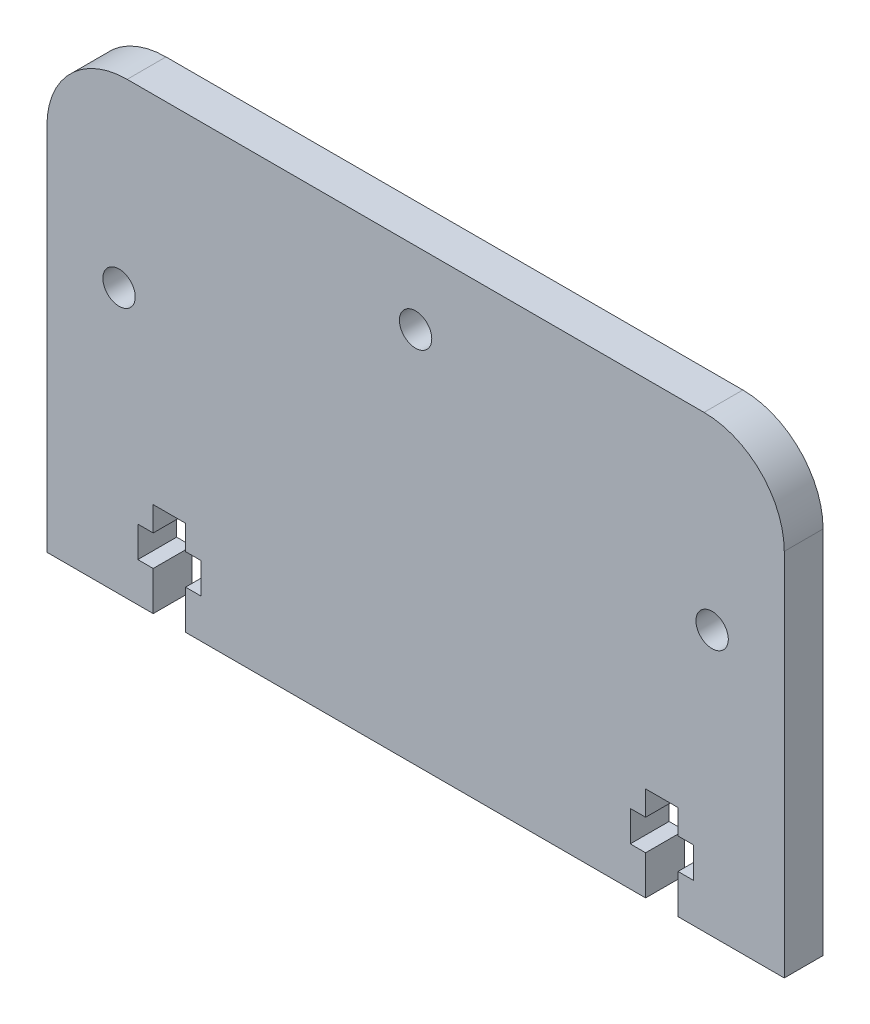
ISO-10303-21;
HEADER;
FILE_DESCRIPTION(('STEP AP214'),'2;1');
FILE_NAME('part.step','',(''),(''),'','','');
FILE_SCHEMA(('AUTOMOTIVE_DESIGN { 1 0 10303 214 1 1 1 1 }'));
ENDSEC;
DATA;
#1=APPLICATION_CONTEXT('core data for automotive mechanical design processes');
#2=APPLICATION_PROTOCOL_DEFINITION('international standard','automotive_design',2000,#1);
#3=PRODUCT_CONTEXT('',#1,'mechanical');
#4=PRODUCT('Part','Part','',(#3));
#5=PRODUCT_RELATED_PRODUCT_CATEGORY('part','',(#4));
#6=PRODUCT_DEFINITION_FORMATION('','',#4);
#7=PRODUCT_DEFINITION_CONTEXT('part definition',#1,'design');
#8=PRODUCT_DEFINITION('design','',#6,#7);
#9=PRODUCT_DEFINITION_SHAPE('','',#8);
#10=(LENGTH_UNIT() NAMED_UNIT(*) SI_UNIT(.MILLI.,.METRE.));
#11=(NAMED_UNIT(*) PLANE_ANGLE_UNIT() SI_UNIT($,.RADIAN.));
#12=(NAMED_UNIT(*) SI_UNIT($,.STERADIAN.) SOLID_ANGLE_UNIT());
#13=UNCERTAINTY_MEASURE_WITH_UNIT(LENGTH_MEASURE(1.E-05),#10,'distance_accuracy_value','');
#14=(GEOMETRIC_REPRESENTATION_CONTEXT(3) GLOBAL_UNCERTAINTY_ASSIGNED_CONTEXT((#13)) GLOBAL_UNIT_ASSIGNED_CONTEXT((#10,
#11,#12)) REPRESENTATION_CONTEXT('',''));
#15=CARTESIAN_POINT('',(0.,0.,0.));
#16=DIRECTION('',(0.,0.,1.));
#17=DIRECTION('',(1.,0.,0.));
#18=AXIS2_PLACEMENT_3D('',#15,#16,#17);
#19=CARTESIAN_POINT('',(-56.975,0.,6.));
#20=DIRECTION('',(0.,1.,0.));
#21=DIRECTION('',(-1.,0.,0.));
#22=AXIS2_PLACEMENT_3D('',#19,#20,#21);
#23=PLANE('',#22);
#24=DIRECTION('',(0.,0.,1.));
#25=VECTOR('',#24,1.);
#26=CARTESIAN_POINT('',(35.55,0.,0.));
#27=LINE('',#26,#25);
#28=CARTESIAN_POINT('',(35.55,0.,0.));
#29=VERTEX_POINT('',#28);
#30=CARTESIAN_POINT('',(35.55,0.,6.));
#31=VERTEX_POINT('',#30);
#32=EDGE_CURVE('E229',#29,#31,#27,.T.);
#33=ORIENTED_EDGE('',*,*,#32,.T.);
#34=DIRECTION('',(1.,0.,0.));
#35=VECTOR('',#34,1.);
#36=CARTESIAN_POINT('',(-56.975,0.,6.));
#37=LINE('',#36,#35);
#38=CARTESIAN_POINT('',(-35.55,0.,6.));
#39=VERTEX_POINT('',#38);
#40=EDGE_CURVE('E372',#39,#31,#37,.T.);
#41=ORIENTED_EDGE('',*,*,#40,.F.);
#42=DIRECTION('',(0.,0.,1.));
#43=VECTOR('',#42,1.);
#44=CARTESIAN_POINT('',(-35.55,0.,0.));
#45=LINE('',#44,#43);
#46=CARTESIAN_POINT('',(-35.55,0.,0.));
#47=VERTEX_POINT('',#46);
#48=EDGE_CURVE('E255',#47,#39,#45,.T.);
#49=ORIENTED_EDGE('',*,*,#48,.F.);
#50=DIRECTION('',(1.,0.,0.));
#51=VECTOR('',#50,1.);
#52=CARTESIAN_POINT('',(-56.975,0.,0.));
#53=LINE('',#52,#51);
#54=EDGE_CURVE('E249',#47,#29,#53,.T.);
#55=ORIENTED_EDGE('',*,*,#54,.T.);
#56=EDGE_LOOP('',(#33,#41,#49,#55));
#57=FACE_BOUND('',#56,.T.);
#58=ADVANCED_FACE('F33',(#57),#23,.F.);
#59=DIRECTION('',(0.,0.,1.));
#60=VECTOR('',#59,1.);
#61=CARTESIAN_POINT('',(40.55,0.,0.));
#62=LINE('',#61,#60);
#63=CARTESIAN_POINT('',(40.55,0.,0.));
#64=VERTEX_POINT('',#63);
#65=CARTESIAN_POINT('',(40.55,0.,6.));
#66=VERTEX_POINT('',#65);
#67=EDGE_CURVE('E241',#64,#66,#62,.T.);
#68=ORIENTED_EDGE('',*,*,#67,.F.);
#69=CARTESIAN_POINT('',(56.975,0.,0.));
#70=VERTEX_POINT('',#69);
#71=EDGE_CURVE('E257',#64,#70,#53,.T.);
#72=ORIENTED_EDGE('',*,*,#71,.T.);
#73=DIRECTION('',(0.,0.,-1.));
#74=VECTOR('',#73,1.);
#75=CARTESIAN_POINT('',(56.975,0.,6.));
#76=LINE('',#75,#74);
#77=CARTESIAN_POINT('',(56.975,0.,6.));
#78=VERTEX_POINT('',#77);
#79=EDGE_CURVE('E281',#78,#70,#76,.T.);
#80=ORIENTED_EDGE('',*,*,#79,.F.);
#81=EDGE_CURVE('E369',#66,#78,#37,.T.);
#82=ORIENTED_EDGE('',*,*,#81,.F.);
#83=EDGE_LOOP('',(#68,#72,#80,#82));
#84=FACE_BOUND('',#83,.T.);
#85=ADVANCED_FACE('F403',(#84),#23,.F.);
#86=CARTESIAN_POINT('',(-44.575,57.1,6.));
#87=DIRECTION('',(0.,0.,-1.));
#88=DIRECTION('',(-1.,0.,0.));
#89=AXIS2_PLACEMENT_3D('',#86,#87,#88);
#90=PLANE('',#89);
#91=CARTESIAN_POINT('',(45.825,41.,6.));
#92=DIRECTION('',(0.,0.,-1.));
#93=DIRECTION('',(-1.,0.,0.));
#94=AXIS2_PLACEMENT_3D('',#91,#92,#93);
#95=CIRCLE('',#94,2.5);
#96=CARTESIAN_POINT('',(43.325,41.,6.));
#97=VERTEX_POINT('',#96);
#98=EDGE_CURVE('E843',#97,#97,#95,.T.);
#99=ORIENTED_EDGE('',*,*,#98,.T.);
#100=EDGE_LOOP('',(#99));
#101=FACE_BOUND('',#100,.T.);
#102=CARTESIAN_POINT('',(-45.825,41.,6.));
#103=DIRECTION('',(0.,0.,1.));
#104=DIRECTION('',(1.,0.,0.));
#105=AXIS2_PLACEMENT_3D('',#102,#103,#104);
#106=CIRCLE('',#105,2.5);
#107=CARTESIAN_POINT('',(-43.325,41.,6.));
#108=VERTEX_POINT('',#107);
#109=EDGE_CURVE('E482',#108,#108,#106,.T.);
#110=ORIENTED_EDGE('',*,*,#109,.F.);
#111=EDGE_LOOP('',(#110));
#112=FACE_BOUND('',#111,.T.);
#113=CARTESIAN_POINT('',(0.,58.3,6.));
#114=DIRECTION('',(0.,0.,1.));
#115=DIRECTION('',(1.,0.,0.));
#116=AXIS2_PLACEMENT_3D('',#113,#114,#115);
#117=CIRCLE('',#116,2.5);
#118=CARTESIAN_POINT('',(2.5,58.3,6.));
#119=VERTEX_POINT('',#118);
#120=EDGE_CURVE('E460',#119,#119,#117,.T.);
#121=ORIENTED_EDGE('',*,*,#120,.F.);
#122=EDGE_LOOP('',(#121));
#123=FACE_BOUND('',#122,.T.);
#124=DIRECTION('',(0.,1.,0.));
#125=VECTOR('',#124,1.);
#126=CARTESIAN_POINT('',(35.55,0.,6.));
#127=LINE('',#126,#125);
#128=CARTESIAN_POINT('',(35.55,6.05,6.));
#129=VERTEX_POINT('',#128);
#130=EDGE_CURVE('E236',#31,#129,#127,.T.);
#131=ORIENTED_EDGE('',*,*,#130,.T.);
#132=DIRECTION('',(-1.,0.,0.));
#133=VECTOR('',#132,1.);
#134=CARTESIAN_POINT('',(35.55,6.05,6.));
#135=LINE('',#134,#133);
#136=CARTESIAN_POINT('',(33.175,6.05000000000001,6.));
#137=VERTEX_POINT('',#136);
#138=EDGE_CURVE('E252',#129,#137,#135,.T.);
#139=ORIENTED_EDGE('',*,*,#138,.T.);
#140=DIRECTION('',(0.,1.,0.));
#141=VECTOR('',#140,1.);
#142=CARTESIAN_POINT('',(33.175,6.05000000000001,6.));
#143=LINE('',#142,#141);
#144=CARTESIAN_POINT('',(33.175,10.8,6.));
#145=VERTEX_POINT('',#144);
#146=EDGE_CURVE('E453',#137,#145,#143,.T.);
#147=ORIENTED_EDGE('',*,*,#146,.T.);
#148=DIRECTION('',(1.,0.,0.));
#149=VECTOR('',#148,1.);
#150=CARTESIAN_POINT('',(33.175,10.8,6.));
#151=LINE('',#150,#149);
#152=CARTESIAN_POINT('',(35.55,10.8,6.));
#153=VERTEX_POINT('',#152);
#154=EDGE_CURVE('E450',#145,#153,#151,.T.);
#155=ORIENTED_EDGE('',*,*,#154,.T.);
#156=DIRECTION('',(0.,1.,0.));
#157=VECTOR('',#156,1.);
#158=CARTESIAN_POINT('',(35.55,10.8,6.));
#159=LINE('',#158,#157);
#160=CARTESIAN_POINT('',(35.55,14.6,6.));
#161=VERTEX_POINT('',#160);
#162=EDGE_CURVE('E447',#153,#161,#159,.T.);
#163=ORIENTED_EDGE('',*,*,#162,.T.);
#164=DIRECTION('',(1.,0.,0.));
#165=VECTOR('',#164,1.);
#166=CARTESIAN_POINT('',(35.55,14.6,6.));
#167=LINE('',#166,#165);
#168=CARTESIAN_POINT('',(40.55,14.6,6.));
#169=VERTEX_POINT('',#168);
#170=EDGE_CURVE('E444',#161,#169,#167,.T.);
#171=ORIENTED_EDGE('',*,*,#170,.T.);
#172=DIRECTION('',(0.,-1.,0.));
#173=VECTOR('',#172,1.);
#174=CARTESIAN_POINT('',(40.55,14.6,6.));
#175=LINE('',#174,#173);
#176=CARTESIAN_POINT('',(40.55,10.8,6.));
#177=VERTEX_POINT('',#176);
#178=EDGE_CURVE('E441',#169,#177,#175,.T.);
#179=ORIENTED_EDGE('',*,*,#178,.T.);
#180=DIRECTION('',(1.,0.,0.));
#181=VECTOR('',#180,1.);
#182=CARTESIAN_POINT('',(40.55,10.8,6.));
#183=LINE('',#182,#181);
#184=CARTESIAN_POINT('',(42.925,10.8,6.));
#185=VERTEX_POINT('',#184);
#186=EDGE_CURVE('E438',#177,#185,#183,.T.);
#187=ORIENTED_EDGE('',*,*,#186,.T.);
#188=DIRECTION('',(0.,-1.,0.));
#189=VECTOR('',#188,1.);
#190=CARTESIAN_POINT('',(42.925,10.8,6.));
#191=LINE('',#190,#189);
#192=CARTESIAN_POINT('',(42.925,6.05,6.));
#193=VERTEX_POINT('',#192);
#194=EDGE_CURVE('E435',#185,#193,#191,.T.);
#195=ORIENTED_EDGE('',*,*,#194,.T.);
#196=DIRECTION('',(-1.,0.,0.));
#197=VECTOR('',#196,1.);
#198=CARTESIAN_POINT('',(42.925,6.05,6.));
#199=LINE('',#198,#197);
#200=CARTESIAN_POINT('',(40.55,6.05,6.));
#201=VERTEX_POINT('',#200);
#202=EDGE_CURVE('E432',#193,#201,#199,.T.);
#203=ORIENTED_EDGE('',*,*,#202,.T.);
#204=DIRECTION('',(0.,-1.,0.));
#205=VECTOR('',#204,1.);
#206=CARTESIAN_POINT('',(40.55,6.05,6.));
#207=LINE('',#206,#205);
#208=EDGE_CURVE('E428',#201,#66,#207,.T.);
#209=ORIENTED_EDGE('',*,*,#208,.T.);
#210=ORIENTED_EDGE('',*,*,#81,.T.);
#211=DIRECTION('',(0.,1.,0.));
#212=VECTOR('',#211,1.);
#213=CARTESIAN_POINT('',(56.975,0.,6.));
#214=LINE('',#213,#212);
#215=CARTESIAN_POINT('',(56.975,57.1,6.));
#216=VERTEX_POINT('',#215);
#217=EDGE_CURVE('E371',#78,#216,#214,.T.);
#218=ORIENTED_EDGE('',*,*,#217,.T.);
#219=CARTESIAN_POINT('',(44.575,57.1,6.));
#220=DIRECTION('',(0.,0.,1.));
#221=DIRECTION('',(-1.,0.,0.));
#222=AXIS2_PLACEMENT_3D('',#219,#220,#221);
#223=CIRCLE('',#222,12.4);
#224=CARTESIAN_POINT('',(44.575,69.5,6.));
#225=VERTEX_POINT('',#224);
#226=EDGE_CURVE('E374',#216,#225,#223,.T.);
#227=ORIENTED_EDGE('',*,*,#226,.T.);
#228=DIRECTION('',(-1.,0.,0.));
#229=VECTOR('',#228,1.);
#230=CARTESIAN_POINT('',(-44.575,69.5,6.));
#231=LINE('',#230,#229);
#232=CARTESIAN_POINT('',(-44.575,69.5,6.));
#233=VERTEX_POINT('',#232);
#234=EDGE_CURVE('E275',#225,#233,#231,.T.);
#235=ORIENTED_EDGE('',*,*,#234,.T.);
#236=CARTESIAN_POINT('',(-44.575,57.1,6.));
#237=DIRECTION('',(0.,0.,1.));
#238=DIRECTION('',(-1.,0.,0.));
#239=AXIS2_PLACEMENT_3D('',#236,#237,#238);
#240=CIRCLE('',#239,12.4);
#241=CARTESIAN_POINT('',(-56.975,57.1,6.));
#242=VERTEX_POINT('',#241);
#243=EDGE_CURVE('E270',#233,#242,#240,.T.);
#244=ORIENTED_EDGE('',*,*,#243,.T.);
#245=DIRECTION('',(0.,-1.,0.));
#246=VECTOR('',#245,1.);
#247=CARTESIAN_POINT('',(-56.975,0.,6.));
#248=LINE('',#247,#246);
#249=CARTESIAN_POINT('',(-56.975,0.,6.));
#250=VERTEX_POINT('',#249);
#251=EDGE_CURVE('E367',#242,#250,#248,.T.);
#252=ORIENTED_EDGE('',*,*,#251,.T.);
#253=CARTESIAN_POINT('',(-40.55,0.,6.));
#254=VERTEX_POINT('',#253);
#255=EDGE_CURVE('E291',#250,#254,#37,.T.);
#256=ORIENTED_EDGE('',*,*,#255,.T.);
#257=DIRECTION('',(0.,-1.,0.));
#258=VECTOR('',#257,1.);
#259=CARTESIAN_POINT('',(-40.55,6.05,6.));
#260=LINE('',#259,#258);
#261=CARTESIAN_POINT('',(-40.55,6.05,6.));
#262=VERTEX_POINT('',#261);
#263=EDGE_CURVE('E341',#262,#254,#260,.T.);
#264=ORIENTED_EDGE('',*,*,#263,.F.);
#265=DIRECTION('',(1.,0.,0.));
#266=VECTOR('',#265,1.);
#267=CARTESIAN_POINT('',(-42.925,6.05,6.));
#268=LINE('',#267,#266);
#269=CARTESIAN_POINT('',(-42.925,6.05,6.));
#270=VERTEX_POINT('',#269);
#271=EDGE_CURVE('E338',#270,#262,#268,.T.);
#272=ORIENTED_EDGE('',*,*,#271,.F.);
#273=DIRECTION('',(0.,-1.,0.));
#274=VECTOR('',#273,1.);
#275=CARTESIAN_POINT('',(-42.925,10.8,6.));
#276=LINE('',#275,#274);
#277=CARTESIAN_POINT('',(-42.925,10.8,6.));
#278=VERTEX_POINT('',#277);
#279=EDGE_CURVE('E335',#278,#270,#276,.T.);
#280=ORIENTED_EDGE('',*,*,#279,.F.);
#281=DIRECTION('',(-1.,0.,0.));
#282=VECTOR('',#281,1.);
#283=CARTESIAN_POINT('',(-40.55,10.8,6.));
#284=LINE('',#283,#282);
#285=CARTESIAN_POINT('',(-40.55,10.8,6.));
#286=VERTEX_POINT('',#285);
#287=EDGE_CURVE('E332',#286,#278,#284,.T.);
#288=ORIENTED_EDGE('',*,*,#287,.F.);
#289=DIRECTION('',(0.,-1.,0.));
#290=VECTOR('',#289,1.);
#291=CARTESIAN_POINT('',(-40.55,14.6,6.));
#292=LINE('',#291,#290);
#293=CARTESIAN_POINT('',(-40.55,14.6,6.));
#294=VERTEX_POINT('',#293);
#295=EDGE_CURVE('E329',#294,#286,#292,.T.);
#296=ORIENTED_EDGE('',*,*,#295,.F.);
#297=DIRECTION('',(-1.,0.,0.));
#298=VECTOR('',#297,1.);
#299=CARTESIAN_POINT('',(-35.55,14.6,6.));
#300=LINE('',#299,#298);
#301=CARTESIAN_POINT('',(-35.55,14.6,6.));
#302=VERTEX_POINT('',#301);
#303=EDGE_CURVE('E326',#302,#294,#300,.T.);
#304=ORIENTED_EDGE('',*,*,#303,.F.);
#305=DIRECTION('',(0.,1.,0.));
#306=VECTOR('',#305,1.);
#307=CARTESIAN_POINT('',(-35.55,10.8,6.));
#308=LINE('',#307,#306);
#309=CARTESIAN_POINT('',(-35.55,10.8,6.));
#310=VERTEX_POINT('',#309);
#311=EDGE_CURVE('E323',#310,#302,#308,.T.);
#312=ORIENTED_EDGE('',*,*,#311,.F.);
#313=DIRECTION('',(-1.,0.,0.));
#314=VECTOR('',#313,1.);
#315=CARTESIAN_POINT('',(-33.175,10.8,6.));
#316=LINE('',#315,#314);
#317=CARTESIAN_POINT('',(-33.175,10.8,6.));
#318=VERTEX_POINT('',#317);
#319=EDGE_CURVE('E320',#318,#310,#316,.T.);
#320=ORIENTED_EDGE('',*,*,#319,.F.);
#321=DIRECTION('',(0.,1.,0.));
#322=VECTOR('',#321,1.);
#323=CARTESIAN_POINT('',(-33.175,6.05000000000001,6.));
#324=LINE('',#323,#322);
#325=CARTESIAN_POINT('',(-33.175,6.05000000000001,6.));
#326=VERTEX_POINT('',#325);
#327=EDGE_CURVE('E317',#326,#318,#324,.T.);
#328=ORIENTED_EDGE('',*,*,#327,.F.);
#329=DIRECTION('',(1.,0.,0.));
#330=VECTOR('',#329,1.);
#331=CARTESIAN_POINT('',(-35.55,6.05,6.));
#332=LINE('',#331,#330);
#333=CARTESIAN_POINT('',(-35.55,6.05,6.));
#334=VERTEX_POINT('',#333);
#335=EDGE_CURVE('E313',#334,#326,#332,.T.);
#336=ORIENTED_EDGE('',*,*,#335,.F.);
#337=DIRECTION('',(0.,1.,0.));
#338=VECTOR('',#337,1.);
#339=CARTESIAN_POINT('',(-35.55,0.,6.));
#340=LINE('',#339,#338);
#341=EDGE_CURVE('E310',#39,#334,#340,.T.);
#342=ORIENTED_EDGE('',*,*,#341,.F.);
#343=ORIENTED_EDGE('',*,*,#40,.T.);
#344=EDGE_LOOP('',(#131,#139,#147,#155,#163,#171,#179,#187,#195,#203,#209,#210,#218,#227,#235,
#244,#252,#256,#264,#272,#280,#288,#296,#304,#312,#320,#328,#336,#342,#343));
#345=FACE_BOUND('',#344,.T.);
#346=ADVANCED_FACE('F383',(#101,#112,#123,#345),#90,.F.);
#347=CARTESIAN_POINT('',(-44.575,57.1,0.));
#348=DIRECTION('',(0.,0.,-1.));
#349=DIRECTION('',(-1.,0.,0.));
#350=AXIS2_PLACEMENT_3D('',#347,#348,#349);
#351=PLANE('',#350);
#352=CARTESIAN_POINT('',(45.825,41.,0.));
#353=DIRECTION('',(0.,0.,-1.));
#354=DIRECTION('',(-1.,0.,0.));
#355=AXIS2_PLACEMENT_3D('',#352,#353,#354);
#356=CIRCLE('',#355,2.5);
#357=CARTESIAN_POINT('',(43.325,41.,0.));
#358=VERTEX_POINT('',#357);
#359=EDGE_CURVE('E429',#358,#358,#356,.T.);
#360=ORIENTED_EDGE('',*,*,#359,.F.);
#361=EDGE_LOOP('',(#360));
#362=FACE_BOUND('',#361,.T.);
#363=CARTESIAN_POINT('',(0.,58.3,0.));
#364=DIRECTION('',(0.,0.,1.));
#365=DIRECTION('',(1.,0.,0.));
#366=AXIS2_PLACEMENT_3D('',#363,#364,#365);
#367=CIRCLE('',#366,2.5);
#368=CARTESIAN_POINT('',(2.5,58.3,0.));
#369=VERTEX_POINT('',#368);
#370=EDGE_CURVE('E479',#369,#369,#367,.T.);
#371=ORIENTED_EDGE('',*,*,#370,.T.);
#372=EDGE_LOOP('',(#371));
#373=FACE_BOUND('',#372,.T.);
#374=CARTESIAN_POINT('',(-45.825,41.,0.));
#375=DIRECTION('',(0.,0.,1.));
#376=DIRECTION('',(1.,0.,0.));
#377=AXIS2_PLACEMENT_3D('',#374,#375,#376);
#378=CIRCLE('',#377,2.5);
#379=CARTESIAN_POINT('',(-43.325,41.,0.));
#380=VERTEX_POINT('',#379);
#381=EDGE_CURVE('E314',#380,#380,#378,.T.);
#382=ORIENTED_EDGE('',*,*,#381,.T.);
#383=EDGE_LOOP('',(#382));
#384=FACE_BOUND('',#383,.T.);
#385=DIRECTION('',(-1.,0.,0.));
#386=VECTOR('',#385,1.);
#387=CARTESIAN_POINT('',(35.55,6.05,0.));
#388=LINE('',#387,#386);
#389=CARTESIAN_POINT('',(35.55,6.05,0.));
#390=VERTEX_POINT('',#389);
#391=CARTESIAN_POINT('',(33.175,6.05000000000001,0.));
#392=VERTEX_POINT('',#391);
#393=EDGE_CURVE('E242',#390,#392,#388,.T.);
#394=ORIENTED_EDGE('',*,*,#393,.F.);
#395=DIRECTION('',(0.,1.,0.));
#396=VECTOR('',#395,1.);
#397=CARTESIAN_POINT('',(35.55,0.,0.));
#398=LINE('',#397,#396);
#399=EDGE_CURVE('E233',#29,#390,#398,.T.);
#400=ORIENTED_EDGE('',*,*,#399,.F.);
#401=ORIENTED_EDGE('',*,*,#54,.F.);
#402=DIRECTION('',(0.,1.,0.));
#403=VECTOR('',#402,1.);
#404=CARTESIAN_POINT('',(-35.55,0.,0.));
#405=LINE('',#404,#403);
#406=CARTESIAN_POINT('',(-35.55,6.05,0.));
#407=VERTEX_POINT('',#406);
#408=EDGE_CURVE('E343',#47,#407,#405,.T.);
#409=ORIENTED_EDGE('',*,*,#408,.T.);
#410=DIRECTION('',(1.,0.,0.));
#411=VECTOR('',#410,1.);
#412=CARTESIAN_POINT('',(-35.55,6.05,0.));
#413=LINE('',#412,#411);
#414=CARTESIAN_POINT('',(-33.175,6.05000000000001,0.));
#415=VERTEX_POINT('',#414);
#416=EDGE_CURVE('E490',#407,#415,#413,.T.);
#417=ORIENTED_EDGE('',*,*,#416,.T.);
#418=DIRECTION('',(0.,1.,0.));
#419=VECTOR('',#418,1.);
#420=CARTESIAN_POINT('',(-33.175,6.05000000000001,0.));
#421=LINE('',#420,#419);
#422=CARTESIAN_POINT('',(-33.175,10.8,0.));
#423=VERTEX_POINT('',#422);
#424=EDGE_CURVE('E56',#415,#423,#421,.T.);
#425=ORIENTED_EDGE('',*,*,#424,.T.);
#426=DIRECTION('',(-1.,0.,0.));
#427=VECTOR('',#426,1.);
#428=CARTESIAN_POINT('',(-33.175,10.8,0.));
#429=LINE('',#428,#427);
#430=CARTESIAN_POINT('',(-35.55,10.8,0.));
#431=VERTEX_POINT('',#430);
#432=EDGE_CURVE('E494',#423,#431,#429,.T.);
#433=ORIENTED_EDGE('',*,*,#432,.T.);
#434=DIRECTION('',(0.,1.,0.));
#435=VECTOR('',#434,1.);
#436=CARTESIAN_POINT('',(-35.55,10.8,0.));
#437=LINE('',#436,#435);
#438=CARTESIAN_POINT('',(-35.55,14.6,0.));
#439=VERTEX_POINT('',#438);
#440=EDGE_CURVE('E497',#431,#439,#437,.T.);
#441=ORIENTED_EDGE('',*,*,#440,.T.);
#442=DIRECTION('',(-1.,0.,0.));
#443=VECTOR('',#442,1.);
#444=CARTESIAN_POINT('',(-35.55,14.6,0.));
#445=LINE('',#444,#443);
#446=CARTESIAN_POINT('',(-40.55,14.6,0.));
#447=VERTEX_POINT('',#446);
#448=EDGE_CURVE('E500',#439,#447,#445,.T.);
#449=ORIENTED_EDGE('',*,*,#448,.T.);
#450=DIRECTION('',(0.,-1.,0.));
#451=VECTOR('',#450,1.);
#452=CARTESIAN_POINT('',(-40.55,14.6,0.));
#453=LINE('',#452,#451);
#454=CARTESIAN_POINT('',(-40.55,10.8,0.));
#455=VERTEX_POINT('',#454);
#456=EDGE_CURVE('E503',#447,#455,#453,.T.);
#457=ORIENTED_EDGE('',*,*,#456,.T.);
#458=DIRECTION('',(-1.,0.,0.));
#459=VECTOR('',#458,1.);
#460=CARTESIAN_POINT('',(-40.55,10.8,0.));
#461=LINE('',#460,#459);
#462=CARTESIAN_POINT('',(-42.925,10.8,0.));
#463=VERTEX_POINT('',#462);
#464=EDGE_CURVE('E506',#455,#463,#461,.T.);
#465=ORIENTED_EDGE('',*,*,#464,.T.);
#466=DIRECTION('',(0.,-1.,0.));
#467=VECTOR('',#466,1.);
#468=CARTESIAN_POINT('',(-42.925,10.8,0.));
#469=LINE('',#468,#467);
#470=CARTESIAN_POINT('',(-42.925,6.05,0.));
#471=VERTEX_POINT('',#470);
#472=EDGE_CURVE('E306',#463,#471,#469,.T.);
#473=ORIENTED_EDGE('',*,*,#472,.T.);
#474=DIRECTION('',(1.,0.,0.));
#475=VECTOR('',#474,1.);
#476=CARTESIAN_POINT('',(-42.925,6.05,0.));
#477=LINE('',#476,#475);
#478=CARTESIAN_POINT('',(-40.55,6.05,0.));
#479=VERTEX_POINT('',#478);
#480=EDGE_CURVE('E300',#471,#479,#477,.T.);
#481=ORIENTED_EDGE('',*,*,#480,.T.);
#482=DIRECTION('',(0.,-1.,0.));
#483=VECTOR('',#482,1.);
#484=CARTESIAN_POINT('',(-40.55,6.05,0.));
#485=LINE('',#484,#483);
#486=CARTESIAN_POINT('',(-40.55,0.,0.));
#487=VERTEX_POINT('',#486);
#488=EDGE_CURVE('E297',#479,#487,#485,.T.);
#489=ORIENTED_EDGE('',*,*,#488,.T.);
#490=CARTESIAN_POINT('',(-56.975,0.,0.));
#491=VERTEX_POINT('',#490);
#492=EDGE_CURVE('E256',#491,#487,#53,.T.);
#493=ORIENTED_EDGE('',*,*,#492,.F.);
#494=DIRECTION('',(0.,-1.,0.));
#495=VECTOR('',#494,1.);
#496=CARTESIAN_POINT('',(-56.975,0.,0.));
#497=LINE('',#496,#495);
#498=CARTESIAN_POINT('',(-56.975,57.1,0.));
#499=VERTEX_POINT('',#498);
#500=EDGE_CURVE('E261',#499,#491,#497,.T.);
#501=ORIENTED_EDGE('',*,*,#500,.F.);
#502=CARTESIAN_POINT('',(-44.575,57.1,0.));
#503=DIRECTION('',(0.,0.,1.));
#504=DIRECTION('',(-1.,0.,0.));
#505=AXIS2_PLACEMENT_3D('',#502,#503,#504);
#506=CIRCLE('',#505,12.4);
#507=CARTESIAN_POINT('',(-44.575,69.5,0.));
#508=VERTEX_POINT('',#507);
#509=EDGE_CURVE('E345',#508,#499,#506,.T.);
#510=ORIENTED_EDGE('',*,*,#509,.F.);
#511=DIRECTION('',(-1.,0.,0.));
#512=VECTOR('',#511,1.);
#513=CARTESIAN_POINT('',(-44.575,69.5,0.));
#514=LINE('',#513,#512);
#515=CARTESIAN_POINT('',(44.575,69.5,0.));
#516=VERTEX_POINT('',#515);
#517=EDGE_CURVE('E268',#516,#508,#514,.T.);
#518=ORIENTED_EDGE('',*,*,#517,.F.);
#519=CARTESIAN_POINT('',(44.575,57.1,0.));
#520=DIRECTION('',(0.,0.,1.));
#521=DIRECTION('',(-1.,0.,0.));
#522=AXIS2_PLACEMENT_3D('',#519,#520,#521);
#523=CIRCLE('',#522,12.4);
#524=CARTESIAN_POINT('',(56.975,57.1,0.));
#525=VERTEX_POINT('',#524);
#526=EDGE_CURVE('E266',#525,#516,#523,.T.);
#527=ORIENTED_EDGE('',*,*,#526,.F.);
#528=DIRECTION('',(0.,1.,0.));
#529=VECTOR('',#528,1.);
#530=CARTESIAN_POINT('',(56.975,0.,0.));
#531=LINE('',#530,#529);
#532=EDGE_CURVE('E260',#70,#525,#531,.T.);
#533=ORIENTED_EDGE('',*,*,#532,.F.);
#534=ORIENTED_EDGE('',*,*,#71,.F.);
#535=DIRECTION('',(0.,-1.,0.));
#536=VECTOR('',#535,1.);
#537=CARTESIAN_POINT('',(40.55,6.05,0.));
#538=LINE('',#537,#536);
#539=CARTESIAN_POINT('',(40.55,6.05,0.));
#540=VERTEX_POINT('',#539);
#541=EDGE_CURVE('E251',#540,#64,#538,.T.);
#542=ORIENTED_EDGE('',*,*,#541,.F.);
#543=DIRECTION('',(-1.,0.,0.));
#544=VECTOR('',#543,1.);
#545=CARTESIAN_POINT('',(42.925,6.05,0.));
#546=LINE('',#545,#544);
#547=CARTESIAN_POINT('',(42.925,6.05,0.));
#548=VERTEX_POINT('',#547);
#549=EDGE_CURVE('E407',#548,#540,#546,.T.);
#550=ORIENTED_EDGE('',*,*,#549,.F.);
#551=DIRECTION('',(0.,-1.,0.));
#552=VECTOR('',#551,1.);
#553=CARTESIAN_POINT('',(42.925,10.8,0.));
#554=LINE('',#553,#552);
#555=CARTESIAN_POINT('',(42.925,10.8,0.));
#556=VERTEX_POINT('',#555);
#557=EDGE_CURVE('E409',#556,#548,#554,.T.);
#558=ORIENTED_EDGE('',*,*,#557,.F.);
#559=DIRECTION('',(1.,0.,0.));
#560=VECTOR('',#559,1.);
#561=CARTESIAN_POINT('',(40.55,10.8,0.));
#562=LINE('',#561,#560);
#563=CARTESIAN_POINT('',(40.55,10.8,0.));
#564=VERTEX_POINT('',#563);
#565=EDGE_CURVE('E414',#564,#556,#562,.T.);
#566=ORIENTED_EDGE('',*,*,#565,.F.);
#567=DIRECTION('',(0.,-1.,0.));
#568=VECTOR('',#567,1.);
#569=CARTESIAN_POINT('',(40.55,14.6,0.));
#570=LINE('',#569,#568);
#571=CARTESIAN_POINT('',(40.55,14.6,0.));
#572=VERTEX_POINT('',#571);
#573=EDGE_CURVE('E416',#572,#564,#570,.T.);
#574=ORIENTED_EDGE('',*,*,#573,.F.);
#575=DIRECTION('',(1.,0.,0.));
#576=VECTOR('',#575,1.);
#577=CARTESIAN_POINT('',(35.55,14.6,0.));
#578=LINE('',#577,#576);
#579=CARTESIAN_POINT('',(35.55,14.6,0.));
#580=VERTEX_POINT('',#579);
#581=EDGE_CURVE('E418',#580,#572,#578,.T.);
#582=ORIENTED_EDGE('',*,*,#581,.F.);
#583=DIRECTION('',(0.,1.,0.));
#584=VECTOR('',#583,1.);
#585=CARTESIAN_POINT('',(35.55,10.8,0.));
#586=LINE('',#585,#584);
#587=CARTESIAN_POINT('',(35.55,10.8,0.));
#588=VERTEX_POINT('',#587);
#589=EDGE_CURVE('E420',#588,#580,#586,.T.);
#590=ORIENTED_EDGE('',*,*,#589,.F.);
#591=DIRECTION('',(1.,0.,0.));
#592=VECTOR('',#591,1.);
#593=CARTESIAN_POINT('',(33.175,10.8,0.));
#594=LINE('',#593,#592);
#595=CARTESIAN_POINT('',(33.175,10.8,0.));
#596=VERTEX_POINT('',#595);
#597=EDGE_CURVE('E422',#596,#588,#594,.T.);
#598=ORIENTED_EDGE('',*,*,#597,.F.);
#599=DIRECTION('',(0.,1.,0.));
#600=VECTOR('',#599,1.);
#601=CARTESIAN_POINT('',(33.175,6.05000000000001,0.));
#602=LINE('',#601,#600);
#603=EDGE_CURVE('E424',#392,#596,#602,.T.);
#604=ORIENTED_EDGE('',*,*,#603,.F.);
#605=EDGE_LOOP('',(#394,#400,#401,#409,#417,#425,#433,#441,#449,#457,#465,#473,#481,#489,#493,
#501,#510,#518,#527,#533,#534,#542,#550,#558,#566,#574,#582,#590,#598,#604));
#606=FACE_BOUND('',#605,.T.);
#607=ADVANCED_FACE('F247',(#362,#373,#384,#606),#351,.T.);
#608=CARTESIAN_POINT('',(-44.575,57.1,6.));
#609=DIRECTION('',(0.,0.,-1.));
#610=DIRECTION('',(-1.,0.,0.));
#611=AXIS2_PLACEMENT_3D('',#608,#609,#610);
#612=CYLINDRICAL_SURFACE('',#611,12.4);
#613=ORIENTED_EDGE('',*,*,#509,.T.);
#614=DIRECTION('',(0.,0.,-1.));
#615=VECTOR('',#614,1.);
#616=CARTESIAN_POINT('',(-56.975,57.1,6.));
#617=LINE('',#616,#615);
#618=EDGE_CURVE('E11',#242,#499,#617,.T.);
#619=ORIENTED_EDGE('',*,*,#618,.F.);
#620=ORIENTED_EDGE('',*,*,#243,.F.);
#621=DIRECTION('',(0.,0.,-1.));
#622=VECTOR('',#621,1.);
#623=CARTESIAN_POINT('',(-44.575,69.5,6.));
#624=LINE('',#623,#622);
#625=EDGE_CURVE('E271',#233,#508,#624,.T.);
#626=ORIENTED_EDGE('',*,*,#625,.T.);
#627=EDGE_LOOP('',(#613,#619,#620,#626));
#628=FACE_BOUND('',#627,.T.);
#629=ADVANCED_FACE('F35',(#628),#612,.T.);
#630=CARTESIAN_POINT('',(-56.975,0.,6.));
#631=DIRECTION('',(1.,0.,0.));
#632=DIRECTION('',(0.,1.,0.));
#633=AXIS2_PLACEMENT_3D('',#630,#631,#632);
#634=PLANE('',#633);
#635=ORIENTED_EDGE('',*,*,#500,.T.);
#636=DIRECTION('',(0.,0.,-1.));
#637=VECTOR('',#636,1.);
#638=CARTESIAN_POINT('',(-56.975,0.,6.));
#639=LINE('',#638,#637);
#640=EDGE_CURVE('E41',#250,#491,#639,.T.);
#641=ORIENTED_EDGE('',*,*,#640,.F.);
#642=ORIENTED_EDGE('',*,*,#251,.F.);
#643=ORIENTED_EDGE('',*,*,#618,.T.);
#644=EDGE_LOOP('',(#635,#641,#642,#643));
#645=FACE_BOUND('',#644,.T.);
#646=ADVANCED_FACE('F379',(#645),#634,.F.);
#647=ORIENTED_EDGE('',*,*,#492,.T.);
#648=DIRECTION('',(0.,0.,1.));
#649=VECTOR('',#648,1.);
#650=CARTESIAN_POINT('',(-40.55,0.,0.));
#651=LINE('',#650,#649);
#652=EDGE_CURVE('E346',#487,#254,#651,.T.);
#653=ORIENTED_EDGE('',*,*,#652,.T.);
#654=ORIENTED_EDGE('',*,*,#255,.F.);
#655=ORIENTED_EDGE('',*,*,#640,.T.);
#656=EDGE_LOOP('',(#647,#653,#654,#655));
#657=FACE_BOUND('',#656,.T.);
#658=ADVANCED_FACE('F288',(#657),#23,.F.);
#659=CARTESIAN_POINT('',(56.975,0.,6.));
#660=DIRECTION('',(-1.,0.,0.));
#661=DIRECTION('',(0.,-1.,0.));
#662=AXIS2_PLACEMENT_3D('',#659,#660,#661);
#663=PLANE('',#662);
#664=ORIENTED_EDGE('',*,*,#532,.T.);
#665=DIRECTION('',(0.,0.,-1.));
#666=VECTOR('',#665,1.);
#667=CARTESIAN_POINT('',(56.975,57.1,6.));
#668=LINE('',#667,#666);
#669=EDGE_CURVE('E278',#216,#525,#668,.T.);
#670=ORIENTED_EDGE('',*,*,#669,.F.);
#671=ORIENTED_EDGE('',*,*,#217,.F.);
#672=ORIENTED_EDGE('',*,*,#79,.T.);
#673=EDGE_LOOP('',(#664,#670,#671,#672));
#674=FACE_BOUND('',#673,.T.);
#675=ADVANCED_FACE('F398',(#674),#663,.F.);
#676=CARTESIAN_POINT('',(44.575,57.1,6.));
#677=DIRECTION('',(0.,0.,-1.));
#678=DIRECTION('',(-1.,0.,0.));
#679=AXIS2_PLACEMENT_3D('',#676,#677,#678);
#680=CYLINDRICAL_SURFACE('',#679,12.4);
#681=ORIENTED_EDGE('',*,*,#526,.T.);
#682=DIRECTION('',(0.,0.,-1.));
#683=VECTOR('',#682,1.);
#684=CARTESIAN_POINT('',(44.575,69.5,6.));
#685=LINE('',#684,#683);
#686=EDGE_CURVE('E274',#225,#516,#685,.T.);
#687=ORIENTED_EDGE('',*,*,#686,.F.);
#688=ORIENTED_EDGE('',*,*,#226,.F.);
#689=ORIENTED_EDGE('',*,*,#669,.T.);
#690=EDGE_LOOP('',(#681,#687,#688,#689));
#691=FACE_BOUND('',#690,.T.);
#692=ADVANCED_FACE('F394',(#691),#680,.T.);
#693=CARTESIAN_POINT('',(-44.575,69.5,6.));
#694=DIRECTION('',(0.,-1.,0.));
#695=DIRECTION('',(1.,0.,0.));
#696=AXIS2_PLACEMENT_3D('',#693,#694,#695);
#697=PLANE('',#696);
#698=ORIENTED_EDGE('',*,*,#517,.T.);
#699=ORIENTED_EDGE('',*,*,#625,.F.);
#700=ORIENTED_EDGE('',*,*,#234,.F.);
#701=ORIENTED_EDGE('',*,*,#686,.T.);
#702=EDGE_LOOP('',(#698,#699,#700,#701));
#703=FACE_BOUND('',#702,.T.);
#704=ADVANCED_FACE('F388',(#703),#697,.F.);
#705=CARTESIAN_POINT('',(-35.55,0.,0.));
#706=DIRECTION('',(1.,0.,0.));
#707=DIRECTION('',(0.,1.,0.));
#708=AXIS2_PLACEMENT_3D('',#705,#706,#707);
#709=PLANE('',#708);
#710=ORIENTED_EDGE('',*,*,#341,.T.);
#711=DIRECTION('',(0.,0.,1.));
#712=VECTOR('',#711,1.);
#713=CARTESIAN_POINT('',(-35.55,6.05,0.));
#714=LINE('',#713,#712);
#715=EDGE_CURVE('E302',#407,#334,#714,.T.);
#716=ORIENTED_EDGE('',*,*,#715,.F.);
#717=ORIENTED_EDGE('',*,*,#408,.F.);
#718=ORIENTED_EDGE('',*,*,#48,.T.);
#719=EDGE_LOOP('',(#710,#716,#717,#718));
#720=FACE_BOUND('',#719,.T.);
#721=ADVANCED_FACE('F545',(#720),#709,.F.);
#722=CARTESIAN_POINT('',(-40.55,6.05,0.));
#723=DIRECTION('',(-1.,0.,0.));
#724=DIRECTION('',(0.,-1.,0.));
#725=AXIS2_PLACEMENT_3D('',#722,#723,#724);
#726=PLANE('',#725);
#727=ORIENTED_EDGE('',*,*,#263,.T.);
#728=ORIENTED_EDGE('',*,*,#652,.F.);
#729=ORIENTED_EDGE('',*,*,#488,.F.);
#730=DIRECTION('',(0.,0.,1.));
#731=VECTOR('',#730,1.);
#732=CARTESIAN_POINT('',(-40.55,6.05,0.));
#733=LINE('',#732,#731);
#734=EDGE_CURVE('E348',#479,#262,#733,.T.);
#735=ORIENTED_EDGE('',*,*,#734,.T.);
#736=EDGE_LOOP('',(#727,#728,#729,#735));
#737=FACE_BOUND('',#736,.T.);
#738=ADVANCED_FACE('F517',(#737),#726,.F.);
#739=CARTESIAN_POINT('',(-42.925,6.05,0.));
#740=DIRECTION('',(0.,-1.,0.));
#741=DIRECTION('',(0.,0.,-1.));
#742=AXIS2_PLACEMENT_3D('',#739,#740,#741);
#743=PLANE('',#742);
#744=ORIENTED_EDGE('',*,*,#271,.T.);
#745=ORIENTED_EDGE('',*,*,#734,.F.);
#746=ORIENTED_EDGE('',*,*,#480,.F.);
#747=DIRECTION('',(0.,0.,1.));
#748=VECTOR('',#747,1.);
#749=CARTESIAN_POINT('',(-42.925,6.05,0.));
#750=LINE('',#749,#748);
#751=EDGE_CURVE('E350',#471,#270,#750,.T.);
#752=ORIENTED_EDGE('',*,*,#751,.T.);
#753=EDGE_LOOP('',(#744,#745,#746,#752));
#754=FACE_BOUND('',#753,.T.);
#755=ADVANCED_FACE('F515',(#754),#743,.F.);
#756=CARTESIAN_POINT('',(-42.925,10.8,0.));
#757=DIRECTION('',(-1.,0.,0.));
#758=DIRECTION('',(0.,-1.,0.));
#759=AXIS2_PLACEMENT_3D('',#756,#757,#758);
#760=PLANE('',#759);
#761=ORIENTED_EDGE('',*,*,#279,.T.);
#762=ORIENTED_EDGE('',*,*,#751,.F.);
#763=ORIENTED_EDGE('',*,*,#472,.F.);
#764=DIRECTION('',(0.,0.,1.));
#765=VECTOR('',#764,1.);
#766=CARTESIAN_POINT('',(-42.925,10.8,0.));
#767=LINE('',#766,#765);
#768=EDGE_CURVE('E352',#463,#278,#767,.T.);
#769=ORIENTED_EDGE('',*,*,#768,.T.);
#770=EDGE_LOOP('',(#761,#762,#763,#769));
#771=FACE_BOUND('',#770,.T.);
#772=ADVANCED_FACE('F511',(#771),#760,.F.);
#773=CARTESIAN_POINT('',(-40.55,10.8,0.));
#774=DIRECTION('',(0.,1.,0.));
#775=DIRECTION('',(0.,0.,1.));
#776=AXIS2_PLACEMENT_3D('',#773,#774,#775);
#777=PLANE('',#776);
#778=ORIENTED_EDGE('',*,*,#287,.T.);
#779=ORIENTED_EDGE('',*,*,#768,.F.);
#780=ORIENTED_EDGE('',*,*,#464,.F.);
#781=DIRECTION('',(0.,0.,1.));
#782=VECTOR('',#781,1.);
#783=CARTESIAN_POINT('',(-40.55,10.8,0.));
#784=LINE('',#783,#782);
#785=EDGE_CURVE('E354',#455,#286,#784,.T.);
#786=ORIENTED_EDGE('',*,*,#785,.T.);
#787=EDGE_LOOP('',(#778,#779,#780,#786));
#788=FACE_BOUND('',#787,.T.);
#789=ADVANCED_FACE('F522',(#788),#777,.F.);
#790=CARTESIAN_POINT('',(-40.55,14.6,0.));
#791=DIRECTION('',(-1.,0.,0.));
#792=DIRECTION('',(0.,0.,1.));
#793=AXIS2_PLACEMENT_3D('',#790,#791,#792);
#794=PLANE('',#793);
#795=ORIENTED_EDGE('',*,*,#295,.T.);
#796=ORIENTED_EDGE('',*,*,#785,.F.);
#797=ORIENTED_EDGE('',*,*,#456,.F.);
#798=DIRECTION('',(0.,0.,1.));
#799=VECTOR('',#798,1.);
#800=CARTESIAN_POINT('',(-40.55,14.6,0.));
#801=LINE('',#800,#799);
#802=EDGE_CURVE('E356',#447,#294,#801,.T.);
#803=ORIENTED_EDGE('',*,*,#802,.T.);
#804=EDGE_LOOP('',(#795,#796,#797,#803));
#805=FACE_BOUND('',#804,.T.);
#806=ADVANCED_FACE('F525',(#805),#794,.F.);
#807=CARTESIAN_POINT('',(-35.55,14.6,0.));
#808=DIRECTION('',(0.,1.,0.));
#809=DIRECTION('',(-1.,0.,0.));
#810=AXIS2_PLACEMENT_3D('',#807,#808,#809);
#811=PLANE('',#810);
#812=ORIENTED_EDGE('',*,*,#303,.T.);
#813=ORIENTED_EDGE('',*,*,#802,.F.);
#814=ORIENTED_EDGE('',*,*,#448,.F.);
#815=DIRECTION('',(0.,0.,1.));
#816=VECTOR('',#815,1.);
#817=CARTESIAN_POINT('',(-35.55,14.6,0.));
#818=LINE('',#817,#816);
#819=EDGE_CURVE('E358',#439,#302,#818,.T.);
#820=ORIENTED_EDGE('',*,*,#819,.T.);
#821=EDGE_LOOP('',(#812,#813,#814,#820));
#822=FACE_BOUND('',#821,.T.);
#823=ADVANCED_FACE('F528',(#822),#811,.F.);
#824=CARTESIAN_POINT('',(-35.55,10.8,0.));
#825=DIRECTION('',(1.,0.,0.));
#826=DIRECTION('',(0.,0.,-1.));
#827=AXIS2_PLACEMENT_3D('',#824,#825,#826);
#828=PLANE('',#827);
#829=ORIENTED_EDGE('',*,*,#311,.T.);
#830=ORIENTED_EDGE('',*,*,#819,.F.);
#831=ORIENTED_EDGE('',*,*,#440,.F.);
#832=DIRECTION('',(0.,0.,1.));
#833=VECTOR('',#832,1.);
#834=CARTESIAN_POINT('',(-35.55,10.8,0.));
#835=LINE('',#834,#833);
#836=EDGE_CURVE('E360',#431,#310,#835,.T.);
#837=ORIENTED_EDGE('',*,*,#836,.T.);
#838=EDGE_LOOP('',(#829,#830,#831,#837));
#839=FACE_BOUND('',#838,.T.);
#840=ADVANCED_FACE('F533',(#839),#828,.F.);
#841=CARTESIAN_POINT('',(-33.175,10.8,0.));
#842=DIRECTION('',(0.,1.,0.));
#843=DIRECTION('',(0.,0.,1.));
#844=AXIS2_PLACEMENT_3D('',#841,#842,#843);
#845=PLANE('',#844);
#846=ORIENTED_EDGE('',*,*,#319,.T.);
#847=ORIENTED_EDGE('',*,*,#836,.F.);
#848=ORIENTED_EDGE('',*,*,#432,.F.);
#849=DIRECTION('',(0.,0.,1.));
#850=VECTOR('',#849,1.);
#851=CARTESIAN_POINT('',(-33.175,10.8,0.));
#852=LINE('',#851,#850);
#853=EDGE_CURVE('E362',#423,#318,#852,.T.);
#854=ORIENTED_EDGE('',*,*,#853,.T.);
#855=EDGE_LOOP('',(#846,#847,#848,#854));
#856=FACE_BOUND('',#855,.T.);
#857=ADVANCED_FACE('F537',(#856),#845,.F.);
#858=CARTESIAN_POINT('',(-33.175,6.05000000000001,0.));
#859=DIRECTION('',(1.,0.,0.));
#860=DIRECTION('',(0.,0.,-1.));
#861=AXIS2_PLACEMENT_3D('',#858,#859,#860);
#862=PLANE('',#861);
#863=ORIENTED_EDGE('',*,*,#327,.T.);
#864=ORIENTED_EDGE('',*,*,#853,.F.);
#865=ORIENTED_EDGE('',*,*,#424,.F.);
#866=DIRECTION('',(0.,0.,1.));
#867=VECTOR('',#866,1.);
#868=CARTESIAN_POINT('',(-33.175,6.05000000000001,0.));
#869=LINE('',#868,#867);
#870=EDGE_CURVE('E304',#415,#326,#869,.T.);
#871=ORIENTED_EDGE('',*,*,#870,.T.);
#872=EDGE_LOOP('',(#863,#864,#865,#871));
#873=FACE_BOUND('',#872,.T.);
#874=ADVANCED_FACE('F538',(#873),#862,.F.);
#875=CARTESIAN_POINT('',(-35.55,6.05,0.));
#876=DIRECTION('',(0.,-1.,0.));
#877=DIRECTION('',(1.,0.,0.));
#878=AXIS2_PLACEMENT_3D('',#875,#876,#877);
#879=PLANE('',#878);
#880=ORIENTED_EDGE('',*,*,#335,.T.);
#881=ORIENTED_EDGE('',*,*,#870,.F.);
#882=ORIENTED_EDGE('',*,*,#416,.F.);
#883=ORIENTED_EDGE('',*,*,#715,.T.);
#884=EDGE_LOOP('',(#880,#881,#882,#883));
#885=FACE_BOUND('',#884,.T.);
#886=ADVANCED_FACE('F542',(#885),#879,.F.);
#887=CARTESIAN_POINT('',(-45.825,41.,0.));
#888=DIRECTION('',(0.,0.,1.));
#889=DIRECTION('',(1.,0.,0.));
#890=AXIS2_PLACEMENT_3D('',#887,#888,#889);
#891=CYLINDRICAL_SURFACE('',#890,2.5);
#892=ORIENTED_EDGE('',*,*,#381,.F.);
#893=EDGE_LOOP('',(#892));
#894=FACE_BOUND('',#893,.T.);
#895=ORIENTED_EDGE('',*,*,#109,.T.);
#896=EDGE_LOOP('',(#895));
#897=FACE_BOUND('',#896,.T.);
#898=ADVANCED_FACE('F680',(#894,#897),#891,.F.);
#899=CARTESIAN_POINT('',(0.,58.3,0.));
#900=DIRECTION('',(0.,0.,1.));
#901=DIRECTION('',(1.,0.,0.));
#902=AXIS2_PLACEMENT_3D('',#899,#900,#901);
#903=CYLINDRICAL_SURFACE('',#902,2.5);
#904=ORIENTED_EDGE('',*,*,#370,.F.);
#905=EDGE_LOOP('',(#904));
#906=FACE_BOUND('',#905,.T.);
#907=ORIENTED_EDGE('',*,*,#120,.T.);
#908=EDGE_LOOP('',(#907));
#909=FACE_BOUND('',#908,.T.);
#910=ADVANCED_FACE('F688',(#906,#909),#903,.F.);
#911=CARTESIAN_POINT('',(35.55,0.,0.));
#912=DIRECTION('',(1.,0.,0.));
#913=DIRECTION('',(0.,1.,0.));
#914=AXIS2_PLACEMENT_3D('',#911,#912,#913);
#915=PLANE('',#914);
#916=ORIENTED_EDGE('',*,*,#130,.F.);
#917=ORIENTED_EDGE('',*,*,#32,.F.);
#918=ORIENTED_EDGE('',*,*,#399,.T.);
#919=DIRECTION('',(0.,0.,1.));
#920=VECTOR('',#919,1.);
#921=CARTESIAN_POINT('',(35.55,6.05,0.));
#922=LINE('',#921,#920);
#923=EDGE_CURVE('E458',#390,#129,#922,.T.);
#924=ORIENTED_EDGE('',*,*,#923,.T.);
#925=EDGE_LOOP('',(#916,#917,#918,#924));
#926=FACE_BOUND('',#925,.T.);
#927=ADVANCED_FACE('F231',(#926),#915,.T.);
#928=CARTESIAN_POINT('',(35.55,6.05,0.));
#929=DIRECTION('',(0.,1.,0.));
#930=DIRECTION('',(-1.,0.,0.));
#931=AXIS2_PLACEMENT_3D('',#928,#929,#930);
#932=PLANE('',#931);
#933=ORIENTED_EDGE('',*,*,#138,.F.);
#934=ORIENTED_EDGE('',*,*,#923,.F.);
#935=ORIENTED_EDGE('',*,*,#393,.T.);
#936=DIRECTION('',(0.,0.,1.));
#937=VECTOR('',#936,1.);
#938=CARTESIAN_POINT('',(33.175,6.05000000000001,0.));
#939=LINE('',#938,#937);
#940=EDGE_CURVE('E461',#392,#137,#939,.T.);
#941=ORIENTED_EDGE('',*,*,#940,.T.);
#942=EDGE_LOOP('',(#933,#934,#935,#941));
#943=FACE_BOUND('',#942,.T.);
#944=ADVANCED_FACE('F727',(#943),#932,.T.);
#945=CARTESIAN_POINT('',(33.175,6.05000000000001,0.));
#946=DIRECTION('',(1.,0.,0.));
#947=DIRECTION('',(0.,0.,-1.));
#948=AXIS2_PLACEMENT_3D('',#945,#946,#947);
#949=PLANE('',#948);
#950=ORIENTED_EDGE('',*,*,#146,.F.);
#951=ORIENTED_EDGE('',*,*,#940,.F.);
#952=ORIENTED_EDGE('',*,*,#603,.T.);
#953=DIRECTION('',(0.,0.,1.));
#954=VECTOR('',#953,1.);
#955=CARTESIAN_POINT('',(33.175,10.8,0.));
#956=LINE('',#955,#954);
#957=EDGE_CURVE('E463',#596,#145,#956,.T.);
#958=ORIENTED_EDGE('',*,*,#957,.T.);
#959=EDGE_LOOP('',(#950,#951,#952,#958));
#960=FACE_BOUND('',#959,.T.);
#961=ADVANCED_FACE('F736',(#960),#949,.T.);
#962=CARTESIAN_POINT('',(33.175,10.8,0.));
#963=DIRECTION('',(0.,-1.,0.));
#964=DIRECTION('',(0.,0.,-1.));
#965=AXIS2_PLACEMENT_3D('',#962,#963,#964);
#966=PLANE('',#965);
#967=ORIENTED_EDGE('',*,*,#154,.F.);
#968=ORIENTED_EDGE('',*,*,#957,.F.);
#969=ORIENTED_EDGE('',*,*,#597,.T.);
#970=DIRECTION('',(0.,0.,1.));
#971=VECTOR('',#970,1.);
#972=CARTESIAN_POINT('',(35.55,10.8,0.));
#973=LINE('',#972,#971);
#974=EDGE_CURVE('E465',#588,#153,#973,.T.);
#975=ORIENTED_EDGE('',*,*,#974,.T.);
#976=EDGE_LOOP('',(#967,#968,#969,#975));
#977=FACE_BOUND('',#976,.T.);
#978=ADVANCED_FACE('F746',(#977),#966,.T.);
#979=CARTESIAN_POINT('',(35.55,10.8,0.));
#980=DIRECTION('',(1.,0.,0.));
#981=DIRECTION('',(0.,0.,-1.));
#982=AXIS2_PLACEMENT_3D('',#979,#980,#981);
#983=PLANE('',#982);
#984=ORIENTED_EDGE('',*,*,#162,.F.);
#985=ORIENTED_EDGE('',*,*,#974,.F.);
#986=ORIENTED_EDGE('',*,*,#589,.T.);
#987=DIRECTION('',(0.,0.,1.));
#988=VECTOR('',#987,1.);
#989=CARTESIAN_POINT('',(35.55,14.6,0.));
#990=LINE('',#989,#988);
#991=EDGE_CURVE('E467',#580,#161,#990,.T.);
#992=ORIENTED_EDGE('',*,*,#991,.T.);
#993=EDGE_LOOP('',(#984,#985,#986,#992));
#994=FACE_BOUND('',#993,.T.);
#995=ADVANCED_FACE('F756',(#994),#983,.T.);
#996=CARTESIAN_POINT('',(35.55,14.6,0.));
#997=DIRECTION('',(0.,-1.,0.));
#998=DIRECTION('',(1.,0.,0.));
#999=AXIS2_PLACEMENT_3D('',#996,#997,#998);
#1000=PLANE('',#999);
#1001=ORIENTED_EDGE('',*,*,#170,.F.);
#1002=ORIENTED_EDGE('',*,*,#991,.F.);
#1003=ORIENTED_EDGE('',*,*,#581,.T.);
#1004=DIRECTION('',(0.,0.,1.));
#1005=VECTOR('',#1004,1.);
#1006=CARTESIAN_POINT('',(40.55,14.6,0.));
#1007=LINE('',#1006,#1005);
#1008=EDGE_CURVE('E469',#572,#169,#1007,.T.);
#1009=ORIENTED_EDGE('',*,*,#1008,.T.);
#1010=EDGE_LOOP('',(#1001,#1002,#1003,#1009));
#1011=FACE_BOUND('',#1010,.T.);
#1012=ADVANCED_FACE('F766',(#1011),#1000,.T.);
#1013=CARTESIAN_POINT('',(40.55,14.6,0.));
#1014=DIRECTION('',(-1.,0.,0.));
#1015=DIRECTION('',(0.,0.,1.));
#1016=AXIS2_PLACEMENT_3D('',#1013,#1014,#1015);
#1017=PLANE('',#1016);
#1018=ORIENTED_EDGE('',*,*,#178,.F.);
#1019=ORIENTED_EDGE('',*,*,#1008,.F.);
#1020=ORIENTED_EDGE('',*,*,#573,.T.);
#1021=DIRECTION('',(0.,0.,1.));
#1022=VECTOR('',#1021,1.);
#1023=CARTESIAN_POINT('',(40.55,10.8,0.));
#1024=LINE('',#1023,#1022);
#1025=EDGE_CURVE('E471',#564,#177,#1024,.T.);
#1026=ORIENTED_EDGE('',*,*,#1025,.T.);
#1027=EDGE_LOOP('',(#1018,#1019,#1020,#1026));
#1028=FACE_BOUND('',#1027,.T.);
#1029=ADVANCED_FACE('F776',(#1028),#1017,.T.);
#1030=CARTESIAN_POINT('',(40.55,10.8,0.));
#1031=DIRECTION('',(0.,-1.,0.));
#1032=DIRECTION('',(0.,0.,-1.));
#1033=AXIS2_PLACEMENT_3D('',#1030,#1031,#1032);
#1034=PLANE('',#1033);
#1035=ORIENTED_EDGE('',*,*,#186,.F.);
#1036=ORIENTED_EDGE('',*,*,#1025,.F.);
#1037=ORIENTED_EDGE('',*,*,#565,.T.);
#1038=DIRECTION('',(0.,0.,1.));
#1039=VECTOR('',#1038,1.);
#1040=CARTESIAN_POINT('',(42.925,10.8,0.));
#1041=LINE('',#1040,#1039);
#1042=EDGE_CURVE('E473',#556,#185,#1041,.T.);
#1043=ORIENTED_EDGE('',*,*,#1042,.T.);
#1044=EDGE_LOOP('',(#1035,#1036,#1037,#1043));
#1045=FACE_BOUND('',#1044,.T.);
#1046=ADVANCED_FACE('F786',(#1045),#1034,.T.);
#1047=CARTESIAN_POINT('',(42.925,10.8,0.));
#1048=DIRECTION('',(-1.,0.,0.));
#1049=DIRECTION('',(0.,-1.,0.));
#1050=AXIS2_PLACEMENT_3D('',#1047,#1048,#1049);
#1051=PLANE('',#1050);
#1052=ORIENTED_EDGE('',*,*,#194,.F.);
#1053=ORIENTED_EDGE('',*,*,#1042,.F.);
#1054=ORIENTED_EDGE('',*,*,#557,.T.);
#1055=DIRECTION('',(0.,0.,1.));
#1056=VECTOR('',#1055,1.);
#1057=CARTESIAN_POINT('',(42.925,6.05,0.));
#1058=LINE('',#1057,#1056);
#1059=EDGE_CURVE('E475',#548,#193,#1058,.T.);
#1060=ORIENTED_EDGE('',*,*,#1059,.T.);
#1061=EDGE_LOOP('',(#1052,#1053,#1054,#1060));
#1062=FACE_BOUND('',#1061,.T.);
#1063=ADVANCED_FACE('F796',(#1062),#1051,.T.);
#1064=CARTESIAN_POINT('',(42.925,6.05,0.));
#1065=DIRECTION('',(0.,1.,0.));
#1066=DIRECTION('',(0.,0.,1.));
#1067=AXIS2_PLACEMENT_3D('',#1064,#1065,#1066);
#1068=PLANE('',#1067);
#1069=ORIENTED_EDGE('',*,*,#202,.F.);
#1070=ORIENTED_EDGE('',*,*,#1059,.F.);
#1071=ORIENTED_EDGE('',*,*,#549,.T.);
#1072=DIRECTION('',(0.,0.,1.));
#1073=VECTOR('',#1072,1.);
#1074=CARTESIAN_POINT('',(40.55,6.05,0.));
#1075=LINE('',#1074,#1073);
#1076=EDGE_CURVE('E48',#540,#201,#1075,.T.);
#1077=ORIENTED_EDGE('',*,*,#1076,.T.);
#1078=EDGE_LOOP('',(#1069,#1070,#1071,#1077));
#1079=FACE_BOUND('',#1078,.T.);
#1080=ADVANCED_FACE('F806',(#1079),#1068,.T.);
#1081=CARTESIAN_POINT('',(40.55,6.05,0.));
#1082=DIRECTION('',(-1.,0.,0.));
#1083=DIRECTION('',(0.,-1.,0.));
#1084=AXIS2_PLACEMENT_3D('',#1081,#1082,#1083);
#1085=PLANE('',#1084);
#1086=ORIENTED_EDGE('',*,*,#208,.F.);
#1087=ORIENTED_EDGE('',*,*,#1076,.F.);
#1088=ORIENTED_EDGE('',*,*,#541,.T.);
#1089=ORIENTED_EDGE('',*,*,#67,.T.);
#1090=EDGE_LOOP('',(#1086,#1087,#1088,#1089));
#1091=FACE_BOUND('',#1090,.T.);
#1092=ADVANCED_FACE('F816',(#1091),#1085,.T.);
#1093=CARTESIAN_POINT('',(45.825,41.,0.));
#1094=DIRECTION('',(0.,0.,1.));
#1095=DIRECTION('',(1.,0.,0.));
#1096=AXIS2_PLACEMENT_3D('',#1093,#1094,#1095);
#1097=CYLINDRICAL_SURFACE('',#1096,2.5);
#1098=ORIENTED_EDGE('',*,*,#359,.T.);
#1099=EDGE_LOOP('',(#1098));
#1100=FACE_BOUND('',#1099,.T.);
#1101=ORIENTED_EDGE('',*,*,#98,.F.);
#1102=EDGE_LOOP('',(#1101));
#1103=FACE_BOUND('',#1102,.T.);
#1104=ADVANCED_FACE('F826',(#1100,#1103),#1097,.F.);
#1105=CLOSED_SHELL('',(#58,#85,#346,#607,#629,#646,#658,#675,#692,#704,#721,#738,#755,#772,#789,
#806,#823,#840,#857,#874,#886,#898,#910,#927,#944,#961,#978,#995,#1012,#1029,#1046,#1063,#1080,
#1092,#1104));
#1106=MANIFOLD_SOLID_BREP('B2',#1105);
#1107=ADVANCED_BREP_SHAPE_REPRESENTATION('',(#18,#1106),#14);
#1108=SHAPE_DEFINITION_REPRESENTATION(#9,#1107);
ENDSEC;
END-ISO-10303-21;
